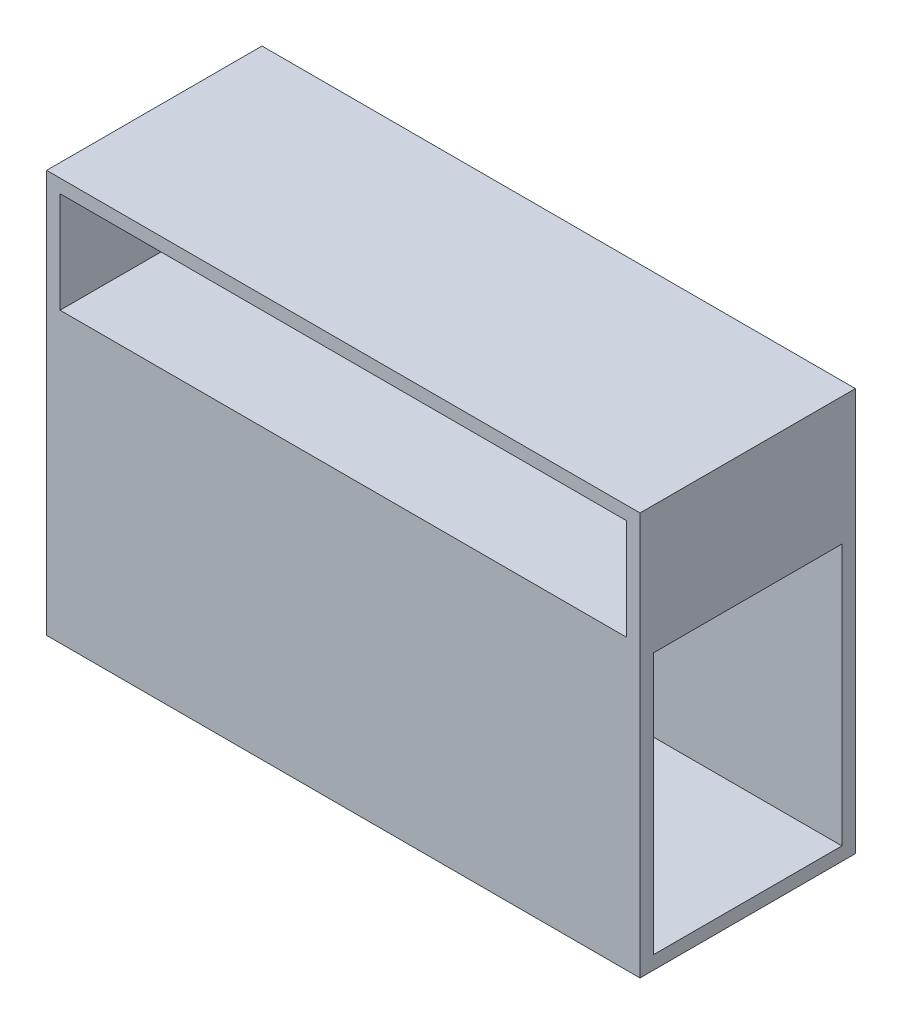
ISO-10303-21;
HEADER;
FILE_DESCRIPTION(('STEP AP214'),'2;1');
FILE_NAME('part.step','',(''),(''),'','','');
FILE_SCHEMA(('AUTOMOTIVE_DESIGN { 1 0 10303 214 1 1 1 1 }'));
ENDSEC;
DATA;
#1=APPLICATION_CONTEXT('core data for automotive mechanical design processes');
#2=APPLICATION_PROTOCOL_DEFINITION('international standard','automotive_design',2000,#1);
#3=PRODUCT_CONTEXT('',#1,'mechanical');
#4=PRODUCT('Part','Part','',(#3));
#5=PRODUCT_RELATED_PRODUCT_CATEGORY('part','',(#4));
#6=PRODUCT_DEFINITION_FORMATION('','',#4);
#7=PRODUCT_DEFINITION_CONTEXT('part definition',#1,'design');
#8=PRODUCT_DEFINITION('design','',#6,#7);
#9=PRODUCT_DEFINITION_SHAPE('','',#8);
#10=(LENGTH_UNIT() NAMED_UNIT(*) SI_UNIT(.MILLI.,.METRE.));
#11=(NAMED_UNIT(*) PLANE_ANGLE_UNIT() SI_UNIT($,.RADIAN.));
#12=(NAMED_UNIT(*) SI_UNIT($,.STERADIAN.) SOLID_ANGLE_UNIT());
#13=UNCERTAINTY_MEASURE_WITH_UNIT(LENGTH_MEASURE(1.E-05),#10,'distance_accuracy_value','');
#14=(GEOMETRIC_REPRESENTATION_CONTEXT(3) GLOBAL_UNCERTAINTY_ASSIGNED_CONTEXT((#13)) GLOBAL_UNIT_ASSIGNED_CONTEXT((#10,
#11,#12)) REPRESENTATION_CONTEXT('',''));
#15=CARTESIAN_POINT('',(0.,0.,0.));
#16=DIRECTION('',(0.,0.,1.));
#17=DIRECTION('',(1.,0.,0.));
#18=AXIS2_PLACEMENT_3D('',#15,#16,#17);
#19=CARTESIAN_POINT('',(42.0842040376021,-27.921405455386,32.));
#20=DIRECTION('',(0.,-1.,0.));
#21=DIRECTION('',(1.,0.,0.));
#22=AXIS2_PLACEMENT_3D('',#19,#20,#21);
#23=PLANE('',#22);
#24=DIRECTION('',(1.,0.,0.));
#25=VECTOR('',#24,1.);
#26=CARTESIAN_POINT('',(-82.978470446033,-27.9214054553861,30.));
#27=LINE('',#26,#25);
#28=CARTESIAN_POINT('',(-44.0842040376021,-27.9214054553861,30.));
#29=VERTEX_POINT('',#28);
#30=CARTESIAN_POINT('',(44.0842040376021,-27.921405455386,30.));
#31=VERTEX_POINT('',#30);
#32=EDGE_CURVE('E134',#29,#31,#27,.T.);
#33=ORIENTED_EDGE('',*,*,#32,.T.);
#34=DIRECTION('',(0.,0.,1.));
#35=VECTOR('',#34,1.);
#36=CARTESIAN_POINT('',(44.0842040376021,-27.921405455386,2.));
#37=LINE('',#36,#35);
#38=CARTESIAN_POINT('',(44.0842040376021,-27.921405455386,2.));
#39=VERTEX_POINT('',#38);
#40=EDGE_CURVE('E137',#39,#31,#37,.T.);
#41=ORIENTED_EDGE('',*,*,#40,.F.);
#42=DIRECTION('',(-1.,0.,0.));
#43=VECTOR('',#42,1.);
#44=CARTESIAN_POINT('',(42.0842040376021,-27.921405455386,2.));
#45=LINE('',#44,#43);
#46=CARTESIAN_POINT('',(-44.0842040376021,-27.9214054553861,2.));
#47=VERTEX_POINT('',#46);
#48=EDGE_CURVE('E172',#39,#47,#45,.T.);
#49=ORIENTED_EDGE('',*,*,#48,.T.);
#50=DIRECTION('',(0.,0.,-1.));
#51=VECTOR('',#50,1.);
#52=CARTESIAN_POINT('',(-44.0842040376021,-27.9214054553861,2.));
#53=LINE('',#52,#51);
#54=EDGE_CURVE('E139',#29,#47,#53,.T.);
#55=ORIENTED_EDGE('',*,*,#54,.F.);
#56=EDGE_LOOP('',(#33,#41,#49,#55));
#57=FACE_BOUND('',#56,.T.);
#58=ADVANCED_FACE('F42',(#57),#23,.F.);
#59=CARTESIAN_POINT('',(-42.0842040376021,10.921405455386,32.));
#60=DIRECTION('',(0.,1.,0.));
#61=DIRECTION('',(-1.,0.,0.));
#62=AXIS2_PLACEMENT_3D('',#59,#60,#61);
#63=PLANE('',#62);
#64=DIRECTION('',(1.,0.,0.));
#65=VECTOR('',#64,1.);
#66=CARTESIAN_POINT('',(-82.978470446033,10.921405455386,30.));
#67=LINE('',#66,#65);
#68=CARTESIAN_POINT('',(-44.0842040376021,10.9214054553861,30.));
#69=VERTEX_POINT('',#68);
#70=CARTESIAN_POINT('',(44.0842040376021,10.9214054553861,30.));
#71=VERTEX_POINT('',#70);
#72=EDGE_CURVE('E57',#69,#71,#67,.T.);
#73=ORIENTED_EDGE('',*,*,#72,.F.);
#74=DIRECTION('',(0.,0.,1.));
#75=VECTOR('',#74,1.);
#76=CARTESIAN_POINT('',(-44.0842040376021,10.921405455386,2.));
#77=LINE('',#76,#75);
#78=CARTESIAN_POINT('',(-44.0842040376021,10.921405455386,2.));
#79=VERTEX_POINT('',#78);
#80=EDGE_CURVE('E156',#79,#69,#77,.T.);
#81=ORIENTED_EDGE('',*,*,#80,.F.);
#82=DIRECTION('',(1.,0.,0.));
#83=VECTOR('',#82,1.);
#84=CARTESIAN_POINT('',(-42.0842040376021,10.921405455386,2.));
#85=LINE('',#84,#83);
#86=CARTESIAN_POINT('',(44.0842040376021,10.921405455386,2.));
#87=VERTEX_POINT('',#86);
#88=EDGE_CURVE('E170',#79,#87,#85,.T.);
#89=ORIENTED_EDGE('',*,*,#88,.T.);
#90=DIRECTION('',(0.,0.,-1.));
#91=VECTOR('',#90,1.);
#92=CARTESIAN_POINT('',(44.0842040376021,10.9214054553861,30.));
#93=LINE('',#92,#91);
#94=EDGE_CURVE('E147',#71,#87,#93,.T.);
#95=ORIENTED_EDGE('',*,*,#94,.F.);
#96=EDGE_LOOP('',(#73,#81,#89,#95));
#97=FACE_BOUND('',#96,.T.);
#98=ADVANCED_FACE('F270',(#97),#63,.F.);
#99=CARTESIAN_POINT('',(0.,0.,2.));
#100=DIRECTION('',(0.,0.,-1.));
#101=DIRECTION('',(-1.,0.,0.));
#102=AXIS2_PLACEMENT_3D('',#99,#100,#101);
#103=PLANE('',#102);
#104=ORIENTED_EDGE('',*,*,#88,.F.);
#105=DIRECTION('',(0.,1.,0.));
#106=VECTOR('',#105,1.);
#107=CARTESIAN_POINT('',(-44.0842040376021,-29.921405455386,2.));
#108=LINE('',#107,#106);
#109=EDGE_CURVE('E12',#47,#79,#108,.T.);
#110=ORIENTED_EDGE('',*,*,#109,.F.);
#111=ORIENTED_EDGE('',*,*,#48,.F.);
#112=DIRECTION('',(0.,-1.,0.));
#113=VECTOR('',#112,1.);
#114=CARTESIAN_POINT('',(44.0842040376021,10.921405455386,2.));
#115=LINE('',#114,#113);
#116=EDGE_CURVE('E140',#87,#39,#115,.T.);
#117=ORIENTED_EDGE('',*,*,#116,.F.);
#118=EDGE_LOOP('',(#104,#110,#111,#117));
#119=FACE_BOUND('',#118,.T.);
#120=ADVANCED_FACE('F274',(#119),#103,.F.);
#121=DIRECTION('',(-1.,0.,0.));
#122=VECTOR('',#121,1.);
#123=CARTESIAN_POINT('',(-42.0842040376021,12.921405455386,2.));
#124=LINE('',#123,#122);
#125=CARTESIAN_POINT('',(42.0842040376021,12.921405455386,2.));
#126=VERTEX_POINT('',#125);
#127=CARTESIAN_POINT('',(-42.0842040376021,12.921405455386,2.));
#128=VERTEX_POINT('',#127);
#129=EDGE_CURVE('E168',#126,#128,#124,.T.);
#130=ORIENTED_EDGE('',*,*,#129,.F.);
#131=DIRECTION('',(0.,-1.,0.));
#132=VECTOR('',#131,1.);
#133=CARTESIAN_POINT('',(42.0842040376021,29.921405455386,2.));
#134=LINE('',#133,#132);
#135=CARTESIAN_POINT('',(42.0842040376021,27.921405455386,2.));
#136=VERTEX_POINT('',#135);
#137=EDGE_CURVE('E184',#136,#126,#134,.T.);
#138=ORIENTED_EDGE('',*,*,#137,.F.);
#139=DIRECTION('',(1.,0.,0.));
#140=VECTOR('',#139,1.);
#141=CARTESIAN_POINT('',(-42.0842040376021,27.921405455386,2.));
#142=LINE('',#141,#140);
#143=CARTESIAN_POINT('',(-42.0842040376021,27.921405455386,2.));
#144=VERTEX_POINT('',#143);
#145=EDGE_CURVE('E175',#144,#136,#142,.T.);
#146=ORIENTED_EDGE('',*,*,#145,.F.);
#147=DIRECTION('',(0.,1.,0.));
#148=VECTOR('',#147,1.);
#149=CARTESIAN_POINT('',(-42.0842040376021,29.921405455386,2.));
#150=LINE('',#149,#148);
#151=EDGE_CURVE('E187',#128,#144,#150,.T.);
#152=ORIENTED_EDGE('',*,*,#151,.F.);
#153=EDGE_LOOP('',(#130,#138,#146,#152));
#154=FACE_BOUND('',#153,.T.);
#155=ADVANCED_FACE('F255',(#154),#103,.F.);
#156=CARTESIAN_POINT('',(-42.0842040376021,29.921405455386,32.));
#157=DIRECTION('',(-1.,0.,0.));
#158=DIRECTION('',(0.,-1.,0.));
#159=AXIS2_PLACEMENT_3D('',#156,#157,#158);
#160=PLANE('',#159);
#161=DIRECTION('',(0.,0.,-1.));
#162=VECTOR('',#161,1.);
#163=CARTESIAN_POINT('',(-42.0842040376021,12.921405455386,32.));
#164=LINE('',#163,#162);
#165=CARTESIAN_POINT('',(-42.0842040376021,12.921405455386,32.));
#166=VERTEX_POINT('',#165);
#167=EDGE_CURVE('E164',#166,#128,#164,.T.);
#168=ORIENTED_EDGE('',*,*,#167,.T.);
#169=ORIENTED_EDGE('',*,*,#151,.T.);
#170=DIRECTION('',(0.,0.,-1.));
#171=VECTOR('',#170,1.);
#172=CARTESIAN_POINT('',(-42.0842040376021,27.921405455386,32.));
#173=LINE('',#172,#171);
#174=CARTESIAN_POINT('',(-42.0842040376021,27.921405455386,32.));
#175=VERTEX_POINT('',#174);
#176=EDGE_CURVE('E180',#175,#144,#173,.T.);
#177=ORIENTED_EDGE('',*,*,#176,.F.);
#178=DIRECTION('',(0.,1.,0.));
#179=VECTOR('',#178,1.);
#180=CARTESIAN_POINT('',(-42.0842040376021,29.921405455386,32.));
#181=LINE('',#180,#179);
#182=EDGE_CURVE('E197',#166,#175,#181,.T.);
#183=ORIENTED_EDGE('',*,*,#182,.F.);
#184=EDGE_LOOP('',(#168,#169,#177,#183));
#185=FACE_BOUND('',#184,.T.);
#186=ADVANCED_FACE('F259',(#185),#160,.F.);
#187=CARTESIAN_POINT('',(42.0842040376021,29.921405455386,32.));
#188=DIRECTION('',(1.,0.,0.));
#189=DIRECTION('',(0.,1.,0.));
#190=AXIS2_PLACEMENT_3D('',#187,#188,#189);
#191=PLANE('',#190);
#192=DIRECTION('',(0.,0.,-1.));
#193=VECTOR('',#192,1.);
#194=CARTESIAN_POINT('',(42.0842040376021,12.921405455386,32.));
#195=LINE('',#194,#193);
#196=CARTESIAN_POINT('',(42.0842040376021,12.921405455386,32.));
#197=VERTEX_POINT('',#196);
#198=EDGE_CURVE('E162',#197,#126,#195,.T.);
#199=ORIENTED_EDGE('',*,*,#198,.F.);
#200=DIRECTION('',(0.,-1.,0.));
#201=VECTOR('',#200,1.);
#202=CARTESIAN_POINT('',(42.0842040376021,29.921405455386,32.));
#203=LINE('',#202,#201);
#204=CARTESIAN_POINT('',(42.0842040376021,27.921405455386,32.));
#205=VERTEX_POINT('',#204);
#206=EDGE_CURVE('E183',#205,#197,#203,.T.);
#207=ORIENTED_EDGE('',*,*,#206,.F.);
#208=DIRECTION('',(0.,0.,-1.));
#209=VECTOR('',#208,1.);
#210=CARTESIAN_POINT('',(42.0842040376021,27.921405455386,32.));
#211=LINE('',#210,#209);
#212=EDGE_CURVE('E65',#205,#136,#211,.T.);
#213=ORIENTED_EDGE('',*,*,#212,.T.);
#214=ORIENTED_EDGE('',*,*,#137,.T.);
#215=EDGE_LOOP('',(#199,#207,#213,#214));
#216=FACE_BOUND('',#215,.T.);
#217=ADVANCED_FACE('F248',(#216),#191,.F.);
#218=CARTESIAN_POINT('',(44.0842040376021,-29.921405455386,2.));
#219=DIRECTION('',(-1.,0.,0.));
#220=DIRECTION('',(0.,0.,1.));
#221=AXIS2_PLACEMENT_3D('',#218,#219,#220);
#222=PLANE('',#221);
#223=ORIENTED_EDGE('',*,*,#116,.T.);
#224=ORIENTED_EDGE('',*,*,#40,.T.);
#225=DIRECTION('',(0.,1.,0.));
#226=VECTOR('',#225,1.);
#227=CARTESIAN_POINT('',(44.0842040376021,-27.921405455386,30.));
#228=LINE('',#227,#226);
#229=EDGE_CURVE('E143',#31,#71,#228,.T.);
#230=ORIENTED_EDGE('',*,*,#229,.T.);
#231=ORIENTED_EDGE('',*,*,#94,.T.);
#232=EDGE_LOOP('',(#223,#224,#230,#231));
#233=FACE_BOUND('',#232,.T.);
#234=DIRECTION('',(0.,1.,0.));
#235=VECTOR('',#234,1.);
#236=CARTESIAN_POINT('',(44.0842040376021,-29.921405455386,0.));
#237=LINE('',#236,#235);
#238=CARTESIAN_POINT('',(44.0842040376021,-29.921405455386,0.));
#239=VERTEX_POINT('',#238);
#240=CARTESIAN_POINT('',(44.0842040376021,29.921405455386,0.));
#241=VERTEX_POINT('',#240);
#242=EDGE_CURVE('E202',#239,#241,#237,.T.);
#243=ORIENTED_EDGE('',*,*,#242,.T.);
#244=DIRECTION('',(0.,0.,-1.));
#245=VECTOR('',#244,1.);
#246=CARTESIAN_POINT('',(44.0842040376021,29.921405455386,2.));
#247=LINE('',#246,#245);
#248=CARTESIAN_POINT('',(44.0842040376021,29.921405455386,32.));
#249=VERTEX_POINT('',#248);
#250=EDGE_CURVE('E50',#249,#241,#247,.T.);
#251=ORIENTED_EDGE('',*,*,#250,.F.);
#252=DIRECTION('',(0.,1.,0.));
#253=VECTOR('',#252,1.);
#254=CARTESIAN_POINT('',(44.0842040376021,29.921405455386,32.));
#255=LINE('',#254,#253);
#256=CARTESIAN_POINT('',(44.0842040376021,-29.921405455386,32.));
#257=VERTEX_POINT('',#256);
#258=EDGE_CURVE('E188',#257,#249,#255,.T.);
#259=ORIENTED_EDGE('',*,*,#258,.F.);
#260=DIRECTION('',(0.,0.,-1.));
#261=VECTOR('',#260,1.);
#262=CARTESIAN_POINT('',(44.0842040376021,-29.921405455386,2.));
#263=LINE('',#262,#261);
#264=EDGE_CURVE('E212',#257,#239,#263,.T.);
#265=ORIENTED_EDGE('',*,*,#264,.T.);
#266=EDGE_LOOP('',(#243,#251,#259,#265));
#267=FACE_BOUND('',#266,.T.);
#268=ADVANCED_FACE('F44',(#233,#267),#222,.F.);
#269=CARTESIAN_POINT('',(-44.0842040376021,29.921405455386,2.));
#270=DIRECTION('',(0.,-1.,0.));
#271=DIRECTION('',(0.,0.,-1.));
#272=AXIS2_PLACEMENT_3D('',#269,#270,#271);
#273=PLANE('',#272);
#274=DIRECTION('',(-1.,0.,0.));
#275=VECTOR('',#274,1.);
#276=CARTESIAN_POINT('',(-44.0842040376021,29.921405455386,0.));
#277=LINE('',#276,#275);
#278=CARTESIAN_POINT('',(-44.0842040376021,29.921405455386,0.));
#279=VERTEX_POINT('',#278);
#280=EDGE_CURVE('E206',#241,#279,#277,.T.);
#281=ORIENTED_EDGE('',*,*,#280,.T.);
#282=DIRECTION('',(0.,0.,-1.));
#283=VECTOR('',#282,1.);
#284=CARTESIAN_POINT('',(-44.0842040376021,29.921405455386,2.));
#285=LINE('',#284,#283);
#286=CARTESIAN_POINT('',(-44.0842040376021,29.921405455386,32.));
#287=VERTEX_POINT('',#286);
#288=EDGE_CURVE('E218',#287,#279,#285,.T.);
#289=ORIENTED_EDGE('',*,*,#288,.F.);
#290=DIRECTION('',(-1.,0.,0.));
#291=VECTOR('',#290,1.);
#292=CARTESIAN_POINT('',(-44.0842040376021,29.921405455386,32.));
#293=LINE('',#292,#291);
#294=EDGE_CURVE('E199',#249,#287,#293,.T.);
#295=ORIENTED_EDGE('',*,*,#294,.F.);
#296=ORIENTED_EDGE('',*,*,#250,.T.);
#297=EDGE_LOOP('',(#281,#289,#295,#296));
#298=FACE_BOUND('',#297,.T.);
#299=ADVANCED_FACE('F223',(#298),#273,.F.);
#300=CARTESIAN_POINT('',(-44.0842040376021,-29.921405455386,2.));
#301=DIRECTION('',(1.,0.,0.));
#302=DIRECTION('',(0.,0.,-1.));
#303=AXIS2_PLACEMENT_3D('',#300,#301,#302);
#304=PLANE('',#303);
#305=DIRECTION('',(0.,1.,0.));
#306=VECTOR('',#305,1.);
#307=CARTESIAN_POINT('',(-44.0842040376021,10.921405455386,30.));
#308=LINE('',#307,#306);
#309=EDGE_CURVE('E155',#29,#69,#308,.T.);
#310=ORIENTED_EDGE('',*,*,#309,.F.);
#311=ORIENTED_EDGE('',*,*,#54,.T.);
#312=ORIENTED_EDGE('',*,*,#109,.T.);
#313=ORIENTED_EDGE('',*,*,#80,.T.);
#314=EDGE_LOOP('',(#310,#311,#312,#313));
#315=FACE_BOUND('',#314,.T.);
#316=DIRECTION('',(0.,0.,-1.));
#317=VECTOR('',#316,1.);
#318=CARTESIAN_POINT('',(-44.0842040376021,-29.921405455386,2.));
#319=LINE('',#318,#317);
#320=CARTESIAN_POINT('',(-44.0842040376021,-29.921405455386,32.));
#321=VERTEX_POINT('',#320);
#322=CARTESIAN_POINT('',(-44.0842040376021,-29.921405455386,0.));
#323=VERTEX_POINT('',#322);
#324=EDGE_CURVE('E215',#321,#323,#319,.T.);
#325=ORIENTED_EDGE('',*,*,#324,.F.);
#326=DIRECTION('',(0.,-1.,0.));
#327=VECTOR('',#326,1.);
#328=CARTESIAN_POINT('',(-44.0842040376021,29.921405455386,32.));
#329=LINE('',#328,#327);
#330=EDGE_CURVE('E193',#287,#321,#329,.T.);
#331=ORIENTED_EDGE('',*,*,#330,.F.);
#332=ORIENTED_EDGE('',*,*,#288,.T.);
#333=DIRECTION('',(0.,-1.,0.));
#334=VECTOR('',#333,1.);
#335=CARTESIAN_POINT('',(-44.0842040376021,-29.921405455386,0.));
#336=LINE('',#335,#334);
#337=EDGE_CURVE('E208',#279,#323,#336,.T.);
#338=ORIENTED_EDGE('',*,*,#337,.T.);
#339=EDGE_LOOP('',(#325,#331,#332,#338));
#340=FACE_BOUND('',#339,.T.);
#341=ADVANCED_FACE('F233',(#315,#340),#304,.F.);
#342=CARTESIAN_POINT('',(-44.0842040376021,-29.921405455386,2.));
#343=DIRECTION('',(0.,1.,0.));
#344=DIRECTION('',(0.,0.,1.));
#345=AXIS2_PLACEMENT_3D('',#342,#343,#344);
#346=PLANE('',#345);
#347=DIRECTION('',(1.,0.,0.));
#348=VECTOR('',#347,1.);
#349=CARTESIAN_POINT('',(-44.0842040376021,-29.921405455386,0.));
#350=LINE('',#349,#348);
#351=EDGE_CURVE('E210',#323,#239,#350,.T.);
#352=ORIENTED_EDGE('',*,*,#351,.T.);
#353=ORIENTED_EDGE('',*,*,#264,.F.);
#354=DIRECTION('',(1.,0.,0.));
#355=VECTOR('',#354,1.);
#356=CARTESIAN_POINT('',(-44.0842040376021,-29.921405455386,32.));
#357=LINE('',#356,#355);
#358=EDGE_CURVE('E195',#321,#257,#357,.T.);
#359=ORIENTED_EDGE('',*,*,#358,.F.);
#360=ORIENTED_EDGE('',*,*,#324,.T.);
#361=EDGE_LOOP('',(#352,#353,#359,#360));
#362=FACE_BOUND('',#361,.T.);
#363=ADVANCED_FACE('F237',(#362),#346,.F.);
#364=CARTESIAN_POINT('',(0.,0.,0.));
#365=DIRECTION('',(0.,0.,-1.));
#366=DIRECTION('',(-1.,0.,0.));
#367=AXIS2_PLACEMENT_3D('',#364,#365,#366);
#368=PLANE('',#367);
#369=ORIENTED_EDGE('',*,*,#242,.F.);
#370=ORIENTED_EDGE('',*,*,#351,.F.);
#371=ORIENTED_EDGE('',*,*,#337,.F.);
#372=ORIENTED_EDGE('',*,*,#280,.F.);
#373=EDGE_LOOP('',(#369,#370,#371,#372));
#374=FACE_BOUND('',#373,.T.);
#375=ADVANCED_FACE('F229',(#374),#368,.T.);
#376=CARTESIAN_POINT('',(0.,0.,32.));
#377=DIRECTION('',(0.,0.,1.));
#378=DIRECTION('',(1.,0.,0.));
#379=AXIS2_PLACEMENT_3D('',#376,#377,#378);
#380=PLANE('',#379);
#381=ORIENTED_EDGE('',*,*,#330,.T.);
#382=ORIENTED_EDGE('',*,*,#358,.T.);
#383=ORIENTED_EDGE('',*,*,#258,.T.);
#384=ORIENTED_EDGE('',*,*,#294,.T.);
#385=EDGE_LOOP('',(#381,#382,#383,#384));
#386=FACE_BOUND('',#385,.T.);
#387=ORIENTED_EDGE('',*,*,#206,.T.);
#388=DIRECTION('',(-1.,0.,0.));
#389=VECTOR('',#388,1.);
#390=CARTESIAN_POINT('',(-42.0842040376021,12.921405455386,32.));
#391=LINE('',#390,#389);
#392=EDGE_CURVE('E167',#197,#166,#391,.T.);
#393=ORIENTED_EDGE('',*,*,#392,.T.);
#394=ORIENTED_EDGE('',*,*,#182,.T.);
#395=DIRECTION('',(1.,0.,0.));
#396=VECTOR('',#395,1.);
#397=CARTESIAN_POINT('',(-42.0842040376021,27.921405455386,32.));
#398=LINE('',#397,#396);
#399=EDGE_CURVE('E176',#175,#205,#398,.T.);
#400=ORIENTED_EDGE('',*,*,#399,.T.);
#401=EDGE_LOOP('',(#387,#393,#394,#400));
#402=FACE_BOUND('',#401,.T.);
#403=ADVANCED_FACE('F239',(#386,#402),#380,.T.);
#404=CARTESIAN_POINT('',(-42.0842040376021,27.921405455386,32.));
#405=DIRECTION('',(0.,1.,0.));
#406=DIRECTION('',(0.,0.,1.));
#407=AXIS2_PLACEMENT_3D('',#404,#405,#406);
#408=PLANE('',#407);
#409=ORIENTED_EDGE('',*,*,#145,.T.);
#410=ORIENTED_EDGE('',*,*,#212,.F.);
#411=ORIENTED_EDGE('',*,*,#399,.F.);
#412=ORIENTED_EDGE('',*,*,#176,.T.);
#413=EDGE_LOOP('',(#409,#410,#411,#412));
#414=FACE_BOUND('',#413,.T.);
#415=ADVANCED_FACE('F242',(#414),#408,.F.);
#416=CARTESIAN_POINT('',(-42.0842040376021,12.921405455386,32.));
#417=DIRECTION('',(0.,-1.,0.));
#418=DIRECTION('',(0.,0.,-1.));
#419=AXIS2_PLACEMENT_3D('',#416,#417,#418);
#420=PLANE('',#419);
#421=ORIENTED_EDGE('',*,*,#129,.T.);
#422=ORIENTED_EDGE('',*,*,#167,.F.);
#423=ORIENTED_EDGE('',*,*,#392,.F.);
#424=ORIENTED_EDGE('',*,*,#198,.T.);
#425=EDGE_LOOP('',(#421,#422,#423,#424));
#426=FACE_BOUND('',#425,.T.);
#427=ADVANCED_FACE('F252',(#426),#420,.F.);
#428=CARTESIAN_POINT('',(-82.978470446033,10.921405455386,30.));
#429=DIRECTION('',(0.,0.,1.));
#430=DIRECTION('',(0.,-1.,0.));
#431=AXIS2_PLACEMENT_3D('',#428,#429,#430);
#432=PLANE('',#431);
#433=ORIENTED_EDGE('',*,*,#32,.F.);
#434=ORIENTED_EDGE('',*,*,#309,.T.);
#435=ORIENTED_EDGE('',*,*,#72,.T.);
#436=ORIENTED_EDGE('',*,*,#229,.F.);
#437=EDGE_LOOP('',(#433,#434,#435,#436));
#438=FACE_BOUND('',#437,.T.);
#439=ADVANCED_FACE('F144',(#438),#432,.F.);
#440=CLOSED_SHELL('',(#58,#98,#120,#155,#186,#217,#268,#299,#341,#363,#375,#403,#415,#427,#439));
#441=MANIFOLD_SOLID_BREP('B2',#440);
#442=ADVANCED_BREP_SHAPE_REPRESENTATION('',(#18,#441),#14);
#443=SHAPE_DEFINITION_REPRESENTATION(#9,#442);
ENDSEC;
END-ISO-10303-21;
